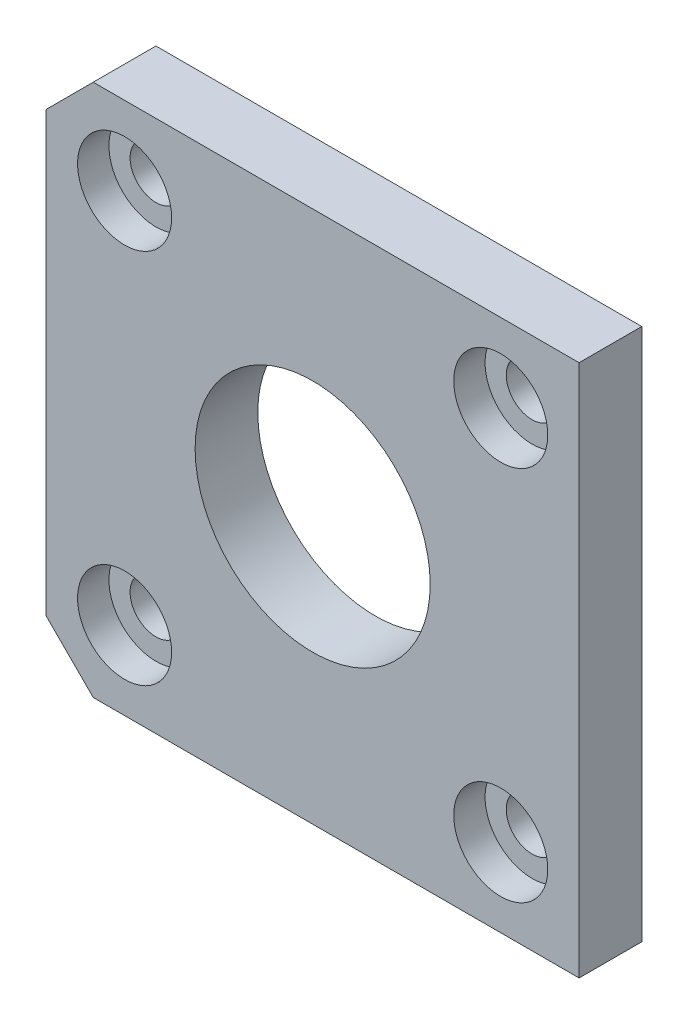
ISO-10303-21;
HEADER;
FILE_DESCRIPTION(('STEP AP214'),'2;1');
FILE_NAME('part.step','',(''),(''),'','','');
FILE_SCHEMA(('AUTOMOTIVE_DESIGN { 1 0 10303 214 1 1 1 1 }'));
ENDSEC;
DATA;
#1=APPLICATION_CONTEXT('core data for automotive mechanical design processes');
#2=APPLICATION_PROTOCOL_DEFINITION('international standard','automotive_design',2000,#1);
#3=PRODUCT_CONTEXT('',#1,'mechanical');
#4=PRODUCT('Part','Part','',(#3));
#5=PRODUCT_RELATED_PRODUCT_CATEGORY('part','',(#4));
#6=PRODUCT_DEFINITION_FORMATION('','',#4);
#7=PRODUCT_DEFINITION_CONTEXT('part definition',#1,'design');
#8=PRODUCT_DEFINITION('design','',#6,#7);
#9=PRODUCT_DEFINITION_SHAPE('','',#8);
#10=(LENGTH_UNIT() NAMED_UNIT(*) SI_UNIT(.MILLI.,.METRE.));
#11=(NAMED_UNIT(*) PLANE_ANGLE_UNIT() SI_UNIT($,.RADIAN.));
#12=(NAMED_UNIT(*) SI_UNIT($,.STERADIAN.) SOLID_ANGLE_UNIT());
#13=UNCERTAINTY_MEASURE_WITH_UNIT(LENGTH_MEASURE(1.E-05),#10,'distance_accuracy_value','');
#14=(GEOMETRIC_REPRESENTATION_CONTEXT(3) GLOBAL_UNCERTAINTY_ASSIGNED_CONTEXT((#13)) GLOBAL_UNIT_ASSIGNED_CONTEXT((#10,
#11,#12)) REPRESENTATION_CONTEXT('',''));
#15=CARTESIAN_POINT('',(0.,0.,0.));
#16=DIRECTION('',(0.,0.,1.));
#17=DIRECTION('',(1.,0.,0.));
#18=AXIS2_PLACEMENT_3D('',#15,#16,#17);
#19=CARTESIAN_POINT('',(5.,29.,4.));
#20=DIRECTION('',(0.,0.,-1.));
#21=DIRECTION('',(-1.,0.,0.));
#22=AXIS2_PLACEMENT_3D('',#19,#20,#21);
#23=CYLINDRICAL_SURFACE('',#22,1.65);
#24=CARTESIAN_POINT('',(5.,29.,0.));
#25=DIRECTION('',(0.,0.,1.));
#26=DIRECTION('',(1.,0.,0.));
#27=AXIS2_PLACEMENT_3D('',#24,#25,#26);
#28=CIRCLE('',#27,1.65);
#29=CARTESIAN_POINT('',(6.65,29.,0.));
#30=VERTEX_POINT('',#29);
#31=EDGE_CURVE('E194',#30,#30,#28,.T.);
#32=ORIENTED_EDGE('',*,*,#31,.F.);
#33=EDGE_LOOP('',(#32));
#34=FACE_BOUND('',#33,.T.);
#35=CARTESIAN_POINT('',(5.,29.,2.));
#36=DIRECTION('',(0.,0.,1.));
#37=DIRECTION('',(1.,0.,0.));
#38=AXIS2_PLACEMENT_3D('',#35,#36,#37);
#39=CIRCLE('',#38,1.65);
#40=CARTESIAN_POINT('',(6.65,29.,2.));
#41=VERTEX_POINT('',#40);
#42=EDGE_CURVE('E43',#41,#41,#39,.T.);
#43=ORIENTED_EDGE('',*,*,#42,.T.);
#44=EDGE_LOOP('',(#43));
#45=FACE_BOUND('',#44,.T.);
#46=ADVANCED_FACE('F39',(#34,#45),#23,.F.);
#47=CARTESIAN_POINT('',(29.,29.,4.));
#48=DIRECTION('',(0.,0.,-1.));
#49=DIRECTION('',(-1.,0.,0.));
#50=AXIS2_PLACEMENT_3D('',#47,#48,#49);
#51=CYLINDRICAL_SURFACE('',#50,1.65);
#52=CARTESIAN_POINT('',(29.,29.,0.));
#53=DIRECTION('',(0.,0.,1.));
#54=DIRECTION('',(1.,0.,0.));
#55=AXIS2_PLACEMENT_3D('',#52,#53,#54);
#56=CIRCLE('',#55,1.65);
#57=CARTESIAN_POINT('',(30.65,29.,0.));
#58=VERTEX_POINT('',#57);
#59=EDGE_CURVE('E185',#58,#58,#56,.T.);
#60=ORIENTED_EDGE('',*,*,#59,.F.);
#61=EDGE_LOOP('',(#60));
#62=FACE_BOUND('',#61,.T.);
#63=CARTESIAN_POINT('',(29.,29.,2.));
#64=DIRECTION('',(0.,0.,1.));
#65=DIRECTION('',(1.,0.,0.));
#66=AXIS2_PLACEMENT_3D('',#63,#64,#65);
#67=CIRCLE('',#66,1.65);
#68=CARTESIAN_POINT('',(30.65,29.,2.));
#69=VERTEX_POINT('',#68);
#70=EDGE_CURVE('E167',#69,#69,#67,.T.);
#71=ORIENTED_EDGE('',*,*,#70,.T.);
#72=EDGE_LOOP('',(#71));
#73=FACE_BOUND('',#72,.T.);
#74=ADVANCED_FACE('F234',(#62,#73),#51,.F.);
#75=CARTESIAN_POINT('',(5.,5.,4.));
#76=DIRECTION('',(0.,0.,-1.));
#77=DIRECTION('',(-1.,0.,0.));
#78=AXIS2_PLACEMENT_3D('',#75,#76,#77);
#79=CYLINDRICAL_SURFACE('',#78,1.65);
#80=CARTESIAN_POINT('',(5.,5.,0.));
#81=DIRECTION('',(0.,0.,1.));
#82=DIRECTION('',(1.,0.,0.));
#83=AXIS2_PLACEMENT_3D('',#80,#81,#82);
#84=CIRCLE('',#83,1.65);
#85=CARTESIAN_POINT('',(6.65,5.,0.));
#86=VERTEX_POINT('',#85);
#87=EDGE_CURVE('E179',#86,#86,#84,.T.);
#88=ORIENTED_EDGE('',*,*,#87,.F.);
#89=EDGE_LOOP('',(#88));
#90=FACE_BOUND('',#89,.T.);
#91=CARTESIAN_POINT('',(5.,5.,2.));
#92=DIRECTION('',(0.,0.,1.));
#93=DIRECTION('',(1.,0.,0.));
#94=AXIS2_PLACEMENT_3D('',#91,#92,#93);
#95=CIRCLE('',#94,1.65);
#96=CARTESIAN_POINT('',(6.65,5.,2.));
#97=VERTEX_POINT('',#96);
#98=EDGE_CURVE('E163',#97,#97,#95,.T.);
#99=ORIENTED_EDGE('',*,*,#98,.T.);
#100=EDGE_LOOP('',(#99));
#101=FACE_BOUND('',#100,.T.);
#102=ADVANCED_FACE('F240',(#90,#101),#79,.F.);
#103=CARTESIAN_POINT('',(29.,5.,4.));
#104=DIRECTION('',(0.,0.,-1.));
#105=DIRECTION('',(-1.,0.,0.));
#106=AXIS2_PLACEMENT_3D('',#103,#104,#105);
#107=CYLINDRICAL_SURFACE('',#106,1.65);
#108=CARTESIAN_POINT('',(29.,5.,0.));
#109=DIRECTION('',(0.,0.,1.));
#110=DIRECTION('',(1.,0.,0.));
#111=AXIS2_PLACEMENT_3D('',#108,#109,#110);
#112=CIRCLE('',#111,1.65);
#113=CARTESIAN_POINT('',(30.65,5.,0.));
#114=VERTEX_POINT('',#113);
#115=EDGE_CURVE('E174',#114,#114,#112,.T.);
#116=ORIENTED_EDGE('',*,*,#115,.F.);
#117=EDGE_LOOP('',(#116));
#118=FACE_BOUND('',#117,.T.);
#119=CARTESIAN_POINT('',(29.,5.,2.));
#120=DIRECTION('',(0.,0.,1.));
#121=DIRECTION('',(1.,0.,0.));
#122=AXIS2_PLACEMENT_3D('',#119,#120,#121);
#123=CIRCLE('',#122,1.65);
#124=CARTESIAN_POINT('',(30.65,5.,2.));
#125=VERTEX_POINT('',#124);
#126=EDGE_CURVE('E159',#125,#125,#123,.T.);
#127=ORIENTED_EDGE('',*,*,#126,.T.);
#128=EDGE_LOOP('',(#127));
#129=FACE_BOUND('',#128,.T.);
#130=ADVANCED_FACE('F247',(#118,#129),#107,.F.);
#131=CARTESIAN_POINT('',(0.,0.,4.));
#132=DIRECTION('',(0.,0.,-1.));
#133=DIRECTION('',(-1.,0.,0.));
#134=AXIS2_PLACEMENT_3D('',#131,#132,#133);
#135=PLANE('',#134);
#136=CARTESIAN_POINT('',(29.,29.,4.));
#137=DIRECTION('',(0.,0.,1.));
#138=DIRECTION('',(1.,0.,0.));
#139=AXIS2_PLACEMENT_3D('',#136,#137,#138);
#140=CIRCLE('',#139,2.99999999999999);
#141=CARTESIAN_POINT('',(32.,29.,4.));
#142=VERTEX_POINT('',#141);
#143=EDGE_CURVE('E272',#142,#142,#140,.T.);
#144=ORIENTED_EDGE('',*,*,#143,.F.);
#145=EDGE_LOOP('',(#144));
#146=FACE_BOUND('',#145,.T.);
#147=CARTESIAN_POINT('',(5.,5.,4.));
#148=DIRECTION('',(0.,0.,1.));
#149=DIRECTION('',(1.,0.,0.));
#150=AXIS2_PLACEMENT_3D('',#147,#148,#149);
#151=CIRCLE('',#150,3.);
#152=CARTESIAN_POINT('',(8.,5.,4.));
#153=VERTEX_POINT('',#152);
#154=EDGE_CURVE('E273',#153,#153,#151,.T.);
#155=ORIENTED_EDGE('',*,*,#154,.F.);
#156=EDGE_LOOP('',(#155));
#157=FACE_BOUND('',#156,.T.);
#158=CARTESIAN_POINT('',(29.,5.,4.));
#159=DIRECTION('',(0.,0.,1.));
#160=DIRECTION('',(1.,0.,0.));
#161=AXIS2_PLACEMENT_3D('',#158,#159,#160);
#162=CIRCLE('',#161,2.99999999999999);
#163=CARTESIAN_POINT('',(32.,5.,4.));
#164=VERTEX_POINT('',#163);
#165=EDGE_CURVE('E297',#164,#164,#162,.T.);
#166=ORIENTED_EDGE('',*,*,#165,.F.);
#167=EDGE_LOOP('',(#166));
#168=FACE_BOUND('',#167,.T.);
#169=CARTESIAN_POINT('',(5.,29.,4.));
#170=DIRECTION('',(0.,0.,1.));
#171=DIRECTION('',(1.,0.,0.));
#172=AXIS2_PLACEMENT_3D('',#169,#170,#171);
#173=CIRCLE('',#172,3.);
#174=CARTESIAN_POINT('',(8.,29.,4.));
#175=VERTEX_POINT('',#174);
#176=EDGE_CURVE('E188',#175,#175,#173,.T.);
#177=ORIENTED_EDGE('',*,*,#176,.F.);
#178=EDGE_LOOP('',(#177));
#179=FACE_BOUND('',#178,.T.);
#180=DIRECTION('',(0.,1.,0.));
#181=VECTOR('',#180,1.);
#182=CARTESIAN_POINT('',(34.,0.,4.));
#183=LINE('',#182,#181);
#184=CARTESIAN_POINT('',(34.,0.,4.));
#185=VERTEX_POINT('',#184);
#186=CARTESIAN_POINT('',(34.,34.,4.));
#187=VERTEX_POINT('',#186);
#188=EDGE_CURVE('E149',#185,#187,#183,.T.);
#189=ORIENTED_EDGE('',*,*,#188,.T.);
#190=DIRECTION('',(-1.,0.,0.));
#191=VECTOR('',#190,1.);
#192=CARTESIAN_POINT('',(3.,34.,4.));
#193=LINE('',#192,#191);
#194=CARTESIAN_POINT('',(3.,34.,4.));
#195=VERTEX_POINT('',#194);
#196=EDGE_CURVE('E96',#187,#195,#193,.T.);
#197=ORIENTED_EDGE('',*,*,#196,.T.);
#198=DIRECTION('',(-0.707106781186548,-0.707106781186547,0.));
#199=VECTOR('',#198,1.);
#200=CARTESIAN_POINT('',(0.,31.,4.));
#201=LINE('',#200,#199);
#202=CARTESIAN_POINT('',(0.,31.,4.));
#203=VERTEX_POINT('',#202);
#204=EDGE_CURVE('E110',#195,#203,#201,.T.);
#205=ORIENTED_EDGE('',*,*,#204,.T.);
#206=DIRECTION('',(0.,-1.,0.));
#207=VECTOR('',#206,1.);
#208=CARTESIAN_POINT('',(0.,3.,4.));
#209=LINE('',#208,#207);
#210=CARTESIAN_POINT('',(0.,3.,4.));
#211=VERTEX_POINT('',#210);
#212=EDGE_CURVE('E103',#203,#211,#209,.T.);
#213=ORIENTED_EDGE('',*,*,#212,.T.);
#214=DIRECTION('',(0.707106781186548,-0.707106781186548,0.));
#215=VECTOR('',#214,1.);
#216=CARTESIAN_POINT('',(0.,3.,4.));
#217=LINE('',#216,#215);
#218=CARTESIAN_POINT('',(3.,0.,4.));
#219=VERTEX_POINT('',#218);
#220=EDGE_CURVE('E108',#211,#219,#217,.T.);
#221=ORIENTED_EDGE('',*,*,#220,.T.);
#222=DIRECTION('',(1.,0.,0.));
#223=VECTOR('',#222,1.);
#224=CARTESIAN_POINT('',(3.,0.,4.));
#225=LINE('',#224,#223);
#226=EDGE_CURVE('E59',#219,#185,#225,.T.);
#227=ORIENTED_EDGE('',*,*,#226,.T.);
#228=EDGE_LOOP('',(#189,#197,#205,#213,#221,#227));
#229=FACE_BOUND('',#228,.T.);
#230=CARTESIAN_POINT('',(17.,17.,4.));
#231=DIRECTION('',(0.,0.,1.));
#232=DIRECTION('',(1.,0.,0.));
#233=AXIS2_PLACEMENT_3D('',#230,#231,#232);
#234=CIRCLE('',#233,7.5);
#235=CARTESIAN_POINT('',(24.5,17.,4.));
#236=VERTEX_POINT('',#235);
#237=EDGE_CURVE('E137',#236,#236,#234,.T.);
#238=ORIENTED_EDGE('',*,*,#237,.F.);
#239=EDGE_LOOP('',(#238));
#240=FACE_BOUND('',#239,.T.);
#241=ADVANCED_FACE('F105',(#146,#157,#168,#179,#229,#240),#135,.F.);
#242=CARTESIAN_POINT('',(0.,0.,0.));
#243=DIRECTION('',(0.,0.,-1.));
#244=DIRECTION('',(-1.,0.,0.));
#245=AXIS2_PLACEMENT_3D('',#242,#243,#244);
#246=PLANE('',#245);
#247=ORIENTED_EDGE('',*,*,#87,.T.);
#248=EDGE_LOOP('',(#247));
#249=FACE_BOUND('',#248,.T.);
#250=ORIENTED_EDGE('',*,*,#31,.T.);
#251=EDGE_LOOP('',(#250));
#252=FACE_BOUND('',#251,.T.);
#253=DIRECTION('',(0.,1.,0.));
#254=VECTOR('',#253,1.);
#255=CARTESIAN_POINT('',(34.,0.,0.));
#256=LINE('',#255,#254);
#257=CARTESIAN_POINT('',(34.,0.,0.));
#258=VERTEX_POINT('',#257);
#259=CARTESIAN_POINT('',(34.,34.,0.));
#260=VERTEX_POINT('',#259);
#261=EDGE_CURVE('E132',#258,#260,#256,.T.);
#262=ORIENTED_EDGE('',*,*,#261,.F.);
#263=DIRECTION('',(1.,0.,0.));
#264=VECTOR('',#263,1.);
#265=CARTESIAN_POINT('',(3.,0.,0.));
#266=LINE('',#265,#264);
#267=CARTESIAN_POINT('',(3.,0.,0.));
#268=VERTEX_POINT('',#267);
#269=EDGE_CURVE('E88',#268,#258,#266,.T.);
#270=ORIENTED_EDGE('',*,*,#269,.F.);
#271=DIRECTION('',(0.707106781186548,-0.707106781186548,0.));
#272=VECTOR('',#271,1.);
#273=CARTESIAN_POINT('',(0.,3.,0.));
#274=LINE('',#273,#272);
#275=CARTESIAN_POINT('',(0.,3.,0.));
#276=VERTEX_POINT('',#275);
#277=EDGE_CURVE('E82',#276,#268,#274,.T.);
#278=ORIENTED_EDGE('',*,*,#277,.F.);
#279=DIRECTION('',(0.,-1.,0.));
#280=VECTOR('',#279,1.);
#281=CARTESIAN_POINT('',(0.,3.,0.));
#282=LINE('',#281,#280);
#283=CARTESIAN_POINT('',(0.,31.,0.));
#284=VERTEX_POINT('',#283);
#285=EDGE_CURVE('E119',#284,#276,#282,.T.);
#286=ORIENTED_EDGE('',*,*,#285,.F.);
#287=DIRECTION('',(-0.707106781186548,-0.707106781186547,0.));
#288=VECTOR('',#287,1.);
#289=CARTESIAN_POINT('',(0.,31.,0.));
#290=LINE('',#289,#288);
#291=CARTESIAN_POINT('',(3.,34.,0.));
#292=VERTEX_POINT('',#291);
#293=EDGE_CURVE('E140',#292,#284,#290,.T.);
#294=ORIENTED_EDGE('',*,*,#293,.F.);
#295=DIRECTION('',(-1.,0.,0.));
#296=VECTOR('',#295,1.);
#297=CARTESIAN_POINT('',(3.,34.,0.));
#298=LINE('',#297,#296);
#299=EDGE_CURVE('E136',#260,#292,#298,.T.);
#300=ORIENTED_EDGE('',*,*,#299,.F.);
#301=EDGE_LOOP('',(#262,#270,#278,#286,#294,#300));
#302=FACE_BOUND('',#301,.T.);
#303=CARTESIAN_POINT('',(17.,17.,0.));
#304=DIRECTION('',(0.,0.,1.));
#305=DIRECTION('',(1.,0.,0.));
#306=AXIS2_PLACEMENT_3D('',#303,#304,#305);
#307=CIRCLE('',#306,7.5);
#308=CARTESIAN_POINT('',(24.5,17.,0.));
#309=VERTEX_POINT('',#308);
#310=EDGE_CURVE('E198',#309,#309,#307,.T.);
#311=ORIENTED_EDGE('',*,*,#310,.T.);
#312=EDGE_LOOP('',(#311));
#313=FACE_BOUND('',#312,.T.);
#314=ORIENTED_EDGE('',*,*,#59,.T.);
#315=EDGE_LOOP('',(#314));
#316=FACE_BOUND('',#315,.T.);
#317=ORIENTED_EDGE('',*,*,#115,.T.);
#318=EDGE_LOOP('',(#317));
#319=FACE_BOUND('',#318,.T.);
#320=ADVANCED_FACE('F217',(#249,#252,#302,#313,#316,#319),#246,.T.);
#321=CARTESIAN_POINT('',(34.,0.,4.));
#322=DIRECTION('',(-1.,0.,0.));
#323=DIRECTION('',(0.,0.,1.));
#324=AXIS2_PLACEMENT_3D('',#321,#322,#323);
#325=PLANE('',#324);
#326=ORIENTED_EDGE('',*,*,#261,.T.);
#327=DIRECTION('',(0.,0.,-1.));
#328=VECTOR('',#327,1.);
#329=CARTESIAN_POINT('',(34.,34.,4.));
#330=LINE('',#329,#328);
#331=EDGE_CURVE('E11',#187,#260,#330,.T.);
#332=ORIENTED_EDGE('',*,*,#331,.F.);
#333=ORIENTED_EDGE('',*,*,#188,.F.);
#334=DIRECTION('',(0.,0.,-1.));
#335=VECTOR('',#334,1.);
#336=CARTESIAN_POINT('',(34.,0.,4.));
#337=LINE('',#336,#335);
#338=EDGE_CURVE('E128',#185,#258,#337,.T.);
#339=ORIENTED_EDGE('',*,*,#338,.T.);
#340=EDGE_LOOP('',(#326,#332,#333,#339));
#341=FACE_BOUND('',#340,.T.);
#342=ADVANCED_FACE('F41',(#341),#325,.F.);
#343=CARTESIAN_POINT('',(3.,34.,4.));
#344=DIRECTION('',(0.,-1.,0.));
#345=DIRECTION('',(0.,0.,-1.));
#346=AXIS2_PLACEMENT_3D('',#343,#344,#345);
#347=PLANE('',#346);
#348=ORIENTED_EDGE('',*,*,#299,.T.);
#349=DIRECTION('',(0.,0.,-1.));
#350=VECTOR('',#349,1.);
#351=CARTESIAN_POINT('',(3.,34.,4.));
#352=LINE('',#351,#350);
#353=EDGE_CURVE('E50',#195,#292,#352,.T.);
#354=ORIENTED_EDGE('',*,*,#353,.F.);
#355=ORIENTED_EDGE('',*,*,#196,.F.);
#356=ORIENTED_EDGE('',*,*,#331,.T.);
#357=EDGE_LOOP('',(#348,#354,#355,#356));
#358=FACE_BOUND('',#357,.T.);
#359=ADVANCED_FACE('F211',(#358),#347,.F.);
#360=CARTESIAN_POINT('',(0.,31.,4.));
#361=DIRECTION('',(0.707106781186547,-0.707106781186548,0.));
#362=DIRECTION('',(0.707106781186548,0.707106781186547,0.));
#363=AXIS2_PLACEMENT_3D('',#360,#361,#362);
#364=PLANE('',#363);
#365=ORIENTED_EDGE('',*,*,#293,.T.);
#366=DIRECTION('',(0.,0.,-1.));
#367=VECTOR('',#366,1.);
#368=CARTESIAN_POINT('',(0.,31.,4.));
#369=LINE('',#368,#367);
#370=EDGE_CURVE('E121',#203,#284,#369,.T.);
#371=ORIENTED_EDGE('',*,*,#370,.F.);
#372=ORIENTED_EDGE('',*,*,#204,.F.);
#373=ORIENTED_EDGE('',*,*,#353,.T.);
#374=EDGE_LOOP('',(#365,#371,#372,#373));
#375=FACE_BOUND('',#374,.T.);
#376=ADVANCED_FACE('F214',(#375),#364,.F.);
#377=CARTESIAN_POINT('',(0.,3.,4.));
#378=DIRECTION('',(1.,0.,0.));
#379=DIRECTION('',(0.,0.,-1.));
#380=AXIS2_PLACEMENT_3D('',#377,#378,#379);
#381=PLANE('',#380);
#382=ORIENTED_EDGE('',*,*,#285,.T.);
#383=DIRECTION('',(0.,0.,-1.));
#384=VECTOR('',#383,1.);
#385=CARTESIAN_POINT('',(0.,3.,4.));
#386=LINE('',#385,#384);
#387=EDGE_CURVE('E116',#211,#276,#386,.T.);
#388=ORIENTED_EDGE('',*,*,#387,.F.);
#389=ORIENTED_EDGE('',*,*,#212,.F.);
#390=ORIENTED_EDGE('',*,*,#370,.T.);
#391=EDGE_LOOP('',(#382,#388,#389,#390));
#392=FACE_BOUND('',#391,.T.);
#393=ADVANCED_FACE('F117',(#392),#381,.F.);
#394=CARTESIAN_POINT('',(0.,3.,4.));
#395=DIRECTION('',(0.707106781186547,0.707106781186547,0.));
#396=DIRECTION('',(-0.707106781186548,0.707106781186548,0.));
#397=AXIS2_PLACEMENT_3D('',#394,#395,#396);
#398=PLANE('',#397);
#399=ORIENTED_EDGE('',*,*,#277,.T.);
#400=DIRECTION('',(0.,0.,-1.));
#401=VECTOR('',#400,1.);
#402=CARTESIAN_POINT('',(3.,0.,4.));
#403=LINE('',#402,#401);
#404=EDGE_CURVE('E122',#219,#268,#403,.T.);
#405=ORIENTED_EDGE('',*,*,#404,.F.);
#406=ORIENTED_EDGE('',*,*,#220,.F.);
#407=ORIENTED_EDGE('',*,*,#387,.T.);
#408=EDGE_LOOP('',(#399,#405,#406,#407));
#409=FACE_BOUND('',#408,.T.);
#410=ADVANCED_FACE('F124',(#409),#398,.F.);
#411=CARTESIAN_POINT('',(3.,0.,4.));
#412=DIRECTION('',(0.,1.,0.));
#413=DIRECTION('',(0.,0.,1.));
#414=AXIS2_PLACEMENT_3D('',#411,#412,#413);
#415=PLANE('',#414);
#416=ORIENTED_EDGE('',*,*,#269,.T.);
#417=ORIENTED_EDGE('',*,*,#338,.F.);
#418=ORIENTED_EDGE('',*,*,#226,.F.);
#419=ORIENTED_EDGE('',*,*,#404,.T.);
#420=EDGE_LOOP('',(#416,#417,#418,#419));
#421=FACE_BOUND('',#420,.T.);
#422=ADVANCED_FACE('F220',(#421),#415,.F.);
#423=CARTESIAN_POINT('',(17.,17.,4.));
#424=DIRECTION('',(0.,0.,-1.));
#425=DIRECTION('',(-1.,0.,0.));
#426=AXIS2_PLACEMENT_3D('',#423,#424,#425);
#427=CYLINDRICAL_SURFACE('',#426,7.5);
#428=ORIENTED_EDGE('',*,*,#237,.T.);
#429=EDGE_LOOP('',(#428));
#430=FACE_BOUND('',#429,.T.);
#431=ORIENTED_EDGE('',*,*,#310,.F.);
#432=EDGE_LOOP('',(#431));
#433=FACE_BOUND('',#432,.T.);
#434=ADVANCED_FACE('F222',(#430,#433),#427,.F.);
#435=CARTESIAN_POINT('',(29.,5.,2.));
#436=DIRECTION('',(0.,0.,1.));
#437=DIRECTION('',(1.,0.,0.));
#438=AXIS2_PLACEMENT_3D('',#435,#436,#437);
#439=CYLINDRICAL_SURFACE('',#438,2.99999999999999);
#440=CARTESIAN_POINT('',(29.,5.,2.));
#441=DIRECTION('',(0.,0.,1.));
#442=DIRECTION('',(1.,0.,0.));
#443=AXIS2_PLACEMENT_3D('',#440,#441,#442);
#444=CIRCLE('',#443,2.99999999999999);
#445=CARTESIAN_POINT('',(32.,5.,2.));
#446=VERTEX_POINT('',#445);
#447=EDGE_CURVE('E281',#446,#446,#444,.T.);
#448=ORIENTED_EDGE('',*,*,#447,.F.);
#449=EDGE_LOOP('',(#448));
#450=FACE_BOUND('',#449,.T.);
#451=ORIENTED_EDGE('',*,*,#165,.T.);
#452=EDGE_LOOP('',(#451));
#453=FACE_BOUND('',#452,.T.);
#454=ADVANCED_FACE('F228',(#450,#453),#439,.F.);
#455=CARTESIAN_POINT('',(29.,5.,2.));
#456=DIRECTION('',(0.,0.,1.));
#457=DIRECTION('',(1.,0.,0.));
#458=AXIS2_PLACEMENT_3D('',#455,#456,#457);
#459=PLANE('',#458);
#460=ORIENTED_EDGE('',*,*,#126,.F.);
#461=EDGE_LOOP('',(#460));
#462=FACE_BOUND('',#461,.T.);
#463=ORIENTED_EDGE('',*,*,#447,.T.);
#464=EDGE_LOOP('',(#463));
#465=FACE_BOUND('',#464,.T.);
#466=ADVANCED_FACE('F305',(#462,#465),#459,.T.);
#467=CARTESIAN_POINT('',(5.,5.,2.));
#468=DIRECTION('',(0.,0.,1.));
#469=DIRECTION('',(1.,0.,0.));
#470=AXIS2_PLACEMENT_3D('',#467,#468,#469);
#471=CYLINDRICAL_SURFACE('',#470,3.);
#472=CARTESIAN_POINT('',(5.,5.,2.));
#473=DIRECTION('',(0.,0.,1.));
#474=DIRECTION('',(1.,0.,0.));
#475=AXIS2_PLACEMENT_3D('',#472,#473,#474);
#476=CIRCLE('',#475,3.);
#477=CARTESIAN_POINT('',(8.,5.,2.));
#478=VERTEX_POINT('',#477);
#479=EDGE_CURVE('E269',#478,#478,#476,.T.);
#480=ORIENTED_EDGE('',*,*,#479,.F.);
#481=EDGE_LOOP('',(#480));
#482=FACE_BOUND('',#481,.T.);
#483=ORIENTED_EDGE('',*,*,#154,.T.);
#484=EDGE_LOOP('',(#483));
#485=FACE_BOUND('',#484,.T.);
#486=ADVANCED_FACE('F265',(#482,#485),#471,.F.);
#487=CARTESIAN_POINT('',(5.,5.,2.));
#488=DIRECTION('',(0.,0.,1.));
#489=DIRECTION('',(1.,0.,0.));
#490=AXIS2_PLACEMENT_3D('',#487,#488,#489);
#491=PLANE('',#490);
#492=ORIENTED_EDGE('',*,*,#98,.F.);
#493=EDGE_LOOP('',(#492));
#494=FACE_BOUND('',#493,.T.);
#495=ORIENTED_EDGE('',*,*,#479,.T.);
#496=EDGE_LOOP('',(#495));
#497=FACE_BOUND('',#496,.T.);
#498=ADVANCED_FACE('F261',(#494,#497),#491,.T.);
#499=CARTESIAN_POINT('',(29.,29.,2.));
#500=DIRECTION('',(0.,0.,1.));
#501=DIRECTION('',(1.,0.,0.));
#502=AXIS2_PLACEMENT_3D('',#499,#500,#501);
#503=CYLINDRICAL_SURFACE('',#502,2.99999999999999);
#504=CARTESIAN_POINT('',(29.,29.,2.));
#505=DIRECTION('',(0.,0.,1.));
#506=DIRECTION('',(1.,0.,0.));
#507=AXIS2_PLACEMENT_3D('',#504,#505,#506);
#508=CIRCLE('',#507,2.99999999999999);
#509=CARTESIAN_POINT('',(32.,29.,2.));
#510=VERTEX_POINT('',#509);
#511=EDGE_CURVE('E278',#510,#510,#508,.T.);
#512=ORIENTED_EDGE('',*,*,#511,.F.);
#513=EDGE_LOOP('',(#512));
#514=FACE_BOUND('',#513,.T.);
#515=ORIENTED_EDGE('',*,*,#143,.T.);
#516=EDGE_LOOP('',(#515));
#517=FACE_BOUND('',#516,.T.);
#518=ADVANCED_FACE('F264',(#514,#517),#503,.F.);
#519=CARTESIAN_POINT('',(29.,29.,2.));
#520=DIRECTION('',(0.,0.,1.));
#521=DIRECTION('',(1.,0.,0.));
#522=AXIS2_PLACEMENT_3D('',#519,#520,#521);
#523=PLANE('',#522);
#524=ORIENTED_EDGE('',*,*,#70,.F.);
#525=EDGE_LOOP('',(#524));
#526=FACE_BOUND('',#525,.T.);
#527=ORIENTED_EDGE('',*,*,#511,.T.);
#528=EDGE_LOOP('',(#527));
#529=FACE_BOUND('',#528,.T.);
#530=ADVANCED_FACE('F319',(#526,#529),#523,.T.);
#531=CARTESIAN_POINT('',(5.,29.,2.));
#532=DIRECTION('',(0.,0.,1.));
#533=DIRECTION('',(1.,0.,0.));
#534=AXIS2_PLACEMENT_3D('',#531,#532,#533);
#535=CYLINDRICAL_SURFACE('',#534,3.);
#536=CARTESIAN_POINT('',(5.,29.,2.));
#537=DIRECTION('',(0.,0.,1.));
#538=DIRECTION('',(1.,0.,0.));
#539=AXIS2_PLACEMENT_3D('',#536,#537,#538);
#540=CIRCLE('',#539,3.);
#541=CARTESIAN_POINT('',(8.,29.,2.));
#542=VERTEX_POINT('',#541);
#543=EDGE_CURVE('E164',#542,#542,#540,.T.);
#544=ORIENTED_EDGE('',*,*,#543,.F.);
#545=EDGE_LOOP('',(#544));
#546=FACE_BOUND('',#545,.T.);
#547=ORIENTED_EDGE('',*,*,#176,.T.);
#548=EDGE_LOOP('',(#547));
#549=FACE_BOUND('',#548,.T.);
#550=ADVANCED_FACE('F322',(#546,#549),#535,.F.);
#551=CARTESIAN_POINT('',(5.,29.,2.));
#552=DIRECTION('',(0.,0.,1.));
#553=DIRECTION('',(1.,0.,0.));
#554=AXIS2_PLACEMENT_3D('',#551,#552,#553);
#555=PLANE('',#554);
#556=ORIENTED_EDGE('',*,*,#42,.F.);
#557=EDGE_LOOP('',(#556));
#558=FACE_BOUND('',#557,.T.);
#559=ORIENTED_EDGE('',*,*,#543,.T.);
#560=EDGE_LOOP('',(#559));
#561=FACE_BOUND('',#560,.T.);
#562=ADVANCED_FACE('F329',(#558,#561),#555,.T.);
#563=CLOSED_SHELL('',(#46,#74,#102,#130,#241,#320,#342,#359,#376,#393,#410,#422,#434,#454,#466,
#486,#498,#518,#530,#550,#562));
#564=MANIFOLD_SOLID_BREP('B2',#563);
#565=ADVANCED_BREP_SHAPE_REPRESENTATION('',(#18,#564),#14);
#566=SHAPE_DEFINITION_REPRESENTATION(#9,#565);
ENDSEC;
END-ISO-10303-21;
